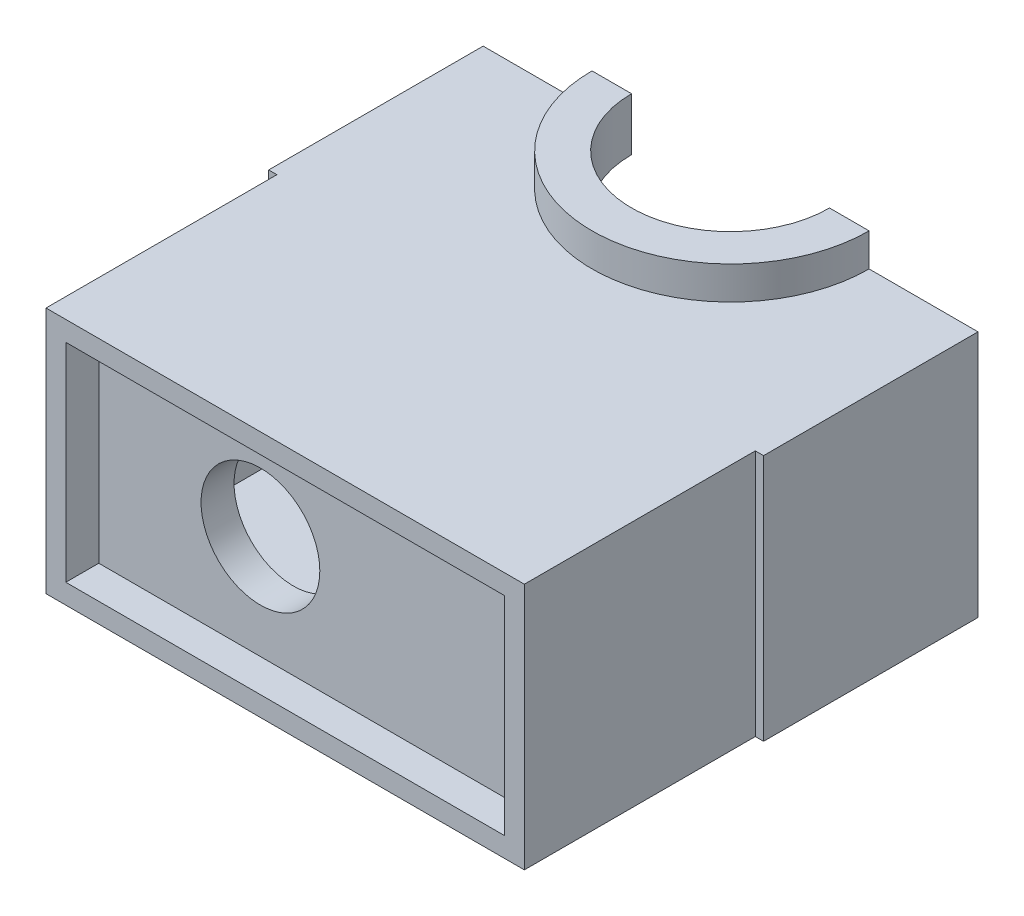
ISO-10303-21;
HEADER;
FILE_DESCRIPTION(('STEP AP214'),'2;1');
FILE_NAME('part.step','',(''),(''),'','','');
FILE_SCHEMA(('AUTOMOTIVE_DESIGN { 1 0 10303 214 1 1 1 1 }'));
ENDSEC;
DATA;
#1=APPLICATION_CONTEXT('core data for automotive mechanical design processes');
#2=APPLICATION_PROTOCOL_DEFINITION('international standard','automotive_design',2000,#1);
#3=PRODUCT_CONTEXT('',#1,'mechanical');
#4=PRODUCT('Part','Part','',(#3));
#5=PRODUCT_RELATED_PRODUCT_CATEGORY('part','',(#4));
#6=PRODUCT_DEFINITION_FORMATION('','',#4);
#7=PRODUCT_DEFINITION_CONTEXT('part definition',#1,'design');
#8=PRODUCT_DEFINITION('design','',#6,#7);
#9=PRODUCT_DEFINITION_SHAPE('','',#8);
#10=(LENGTH_UNIT() NAMED_UNIT(*) SI_UNIT(.MILLI.,.METRE.));
#11=(NAMED_UNIT(*) PLANE_ANGLE_UNIT() SI_UNIT($,.RADIAN.));
#12=(NAMED_UNIT(*) SI_UNIT($,.STERADIAN.) SOLID_ANGLE_UNIT());
#13=UNCERTAINTY_MEASURE_WITH_UNIT(LENGTH_MEASURE(1.E-05),#10,'distance_accuracy_value','');
#14=(GEOMETRIC_REPRESENTATION_CONTEXT(3) GLOBAL_UNCERTAINTY_ASSIGNED_CONTEXT((#13)) GLOBAL_UNIT_ASSIGNED_CONTEXT((#10,
#11,#12)) REPRESENTATION_CONTEXT('',''));
#15=CARTESIAN_POINT('',(0.,0.,0.));
#16=DIRECTION('',(0.,0.,1.));
#17=DIRECTION('',(1.,0.,0.));
#18=AXIS2_PLACEMENT_3D('',#15,#16,#17);
#19=CARTESIAN_POINT('',(0.,0.,-11.5));
#20=DIRECTION('',(0.,0.,-1.));
#21=DIRECTION('',(-1.,0.,0.));
#22=AXIS2_PLACEMENT_3D('',#19,#20,#21);
#23=PLANE('',#22);
#24=DIRECTION('',(-1.,0.,0.));
#25=VECTOR('',#24,1.);
#26=CARTESIAN_POINT('',(0.,3.15,-11.5));
#27=LINE('',#26,#25);
#28=CARTESIAN_POINT('',(8.65,3.15,-11.5));
#29=VERTEX_POINT('',#28);
#30=CARTESIAN_POINT('',(4.75,3.15,-11.5));
#31=VERTEX_POINT('',#30);
#32=EDGE_CURVE('E254',#29,#31,#27,.T.);
#33=ORIENTED_EDGE('',*,*,#32,.T.);
#34=DIRECTION('',(0.,-1.,0.));
#35=VECTOR('',#34,1.);
#36=CARTESIAN_POINT('',(4.75,4.75,-11.5));
#37=LINE('',#36,#35);
#38=CARTESIAN_POINT('',(4.75,4.75,-11.5));
#39=VERTEX_POINT('',#38);
#40=EDGE_CURVE('E448',#39,#31,#37,.T.);
#41=ORIENTED_EDGE('',*,*,#40,.F.);
#42=DIRECTION('',(-1.,0.,0.));
#43=VECTOR('',#42,1.);
#44=CARTESIAN_POINT('',(0.,4.75,-11.5));
#45=LINE('',#44,#43);
#46=CARTESIAN_POINT('',(5.95,4.75,-11.5));
#47=VERTEX_POINT('',#46);
#48=EDGE_CURVE('E458',#47,#39,#45,.T.);
#49=ORIENTED_EDGE('',*,*,#48,.F.);
#50=DIRECTION('',(0.,-1.,0.));
#51=VECTOR('',#50,1.);
#52=CARTESIAN_POINT('',(5.95,4.75,-11.5));
#53=LINE('',#52,#51);
#54=CARTESIAN_POINT('',(5.95,3.75,-11.5));
#55=VERTEX_POINT('',#54);
#56=EDGE_CURVE('E445',#47,#55,#53,.T.);
#57=ORIENTED_EDGE('',*,*,#56,.T.);
#58=DIRECTION('',(1.,0.,0.));
#59=VECTOR('',#58,1.);
#60=CARTESIAN_POINT('',(0.,3.75,-11.5));
#61=LINE('',#60,#59);
#62=CARTESIAN_POINT('',(9.25,3.75,-11.5));
#63=VERTEX_POINT('',#62);
#64=EDGE_CURVE('E282',#55,#63,#61,.T.);
#65=ORIENTED_EDGE('',*,*,#64,.T.);
#66=DIRECTION('',(0.,1.,0.));
#67=VECTOR('',#66,1.);
#68=CARTESIAN_POINT('',(9.25,0.,-11.5));
#69=LINE('',#68,#67);
#70=CARTESIAN_POINT('',(9.25,-3.75,-11.5));
#71=VERTEX_POINT('',#70);
#72=EDGE_CURVE('E436',#71,#63,#69,.T.);
#73=ORIENTED_EDGE('',*,*,#72,.F.);
#74=DIRECTION('',(-1.,0.,0.));
#75=VECTOR('',#74,1.);
#76=CARTESIAN_POINT('',(0.,-3.75,-11.5));
#77=LINE('',#76,#75);
#78=CARTESIAN_POINT('',(5.95,-3.75,-11.5));
#79=VERTEX_POINT('',#78);
#80=EDGE_CURVE('E433',#71,#79,#77,.T.);
#81=ORIENTED_EDGE('',*,*,#80,.T.);
#82=DIRECTION('',(0.,1.,0.));
#83=VECTOR('',#82,1.);
#84=CARTESIAN_POINT('',(5.95,-4.75,-11.5));
#85=LINE('',#84,#83);
#86=CARTESIAN_POINT('',(5.95,-4.75,-11.5));
#87=VERTEX_POINT('',#86);
#88=EDGE_CURVE('E464',#87,#79,#85,.T.);
#89=ORIENTED_EDGE('',*,*,#88,.F.);
#90=DIRECTION('',(1.,0.,0.));
#91=VECTOR('',#90,1.);
#92=CARTESIAN_POINT('',(0.,-4.75,-11.5));
#93=LINE('',#92,#91);
#94=CARTESIAN_POINT('',(4.75,-4.75,-11.5));
#95=VERTEX_POINT('',#94);
#96=EDGE_CURVE('E472',#95,#87,#93,.T.);
#97=ORIENTED_EDGE('',*,*,#96,.F.);
#98=DIRECTION('',(0.,1.,0.));
#99=VECTOR('',#98,1.);
#100=CARTESIAN_POINT('',(4.75,-4.75,-11.5));
#101=LINE('',#100,#99);
#102=CARTESIAN_POINT('',(4.75,-3.15,-11.5));
#103=VERTEX_POINT('',#102);
#104=EDGE_CURVE('E426',#95,#103,#101,.T.);
#105=ORIENTED_EDGE('',*,*,#104,.T.);
#106=DIRECTION('',(-1.,0.,0.));
#107=VECTOR('',#106,1.);
#108=CARTESIAN_POINT('',(0.,-3.15,-11.5));
#109=LINE('',#108,#107);
#110=CARTESIAN_POINT('',(8.65,-3.15,-11.5));
#111=VERTEX_POINT('',#110);
#112=EDGE_CURVE('E245',#111,#103,#109,.T.);
#113=ORIENTED_EDGE('',*,*,#112,.F.);
#114=DIRECTION('',(0.,-1.,0.));
#115=VECTOR('',#114,1.);
#116=CARTESIAN_POINT('',(8.65,0.,-11.5));
#117=LINE('',#116,#115);
#118=EDGE_CURVE('E253',#29,#111,#117,.T.);
#119=ORIENTED_EDGE('',*,*,#118,.F.);
#120=EDGE_LOOP('',(#33,#41,#49,#57,#65,#73,#81,#89,#97,#105,#113,#119));
#121=FACE_BOUND('',#120,.T.);
#122=ADVANCED_FACE('F37',(#121),#23,.T.);
#123=CARTESIAN_POINT('',(0.,0.,-5.));
#124=DIRECTION('',(0.,0.,1.));
#125=DIRECTION('',(1.,0.,0.));
#126=AXIS2_PLACEMENT_3D('',#123,#124,#125);
#127=PLANE('',#126);
#128=DIRECTION('',(-1.,0.,0.));
#129=VECTOR('',#128,1.);
#130=CARTESIAN_POINT('',(0.,3.15,-5.));
#131=LINE('',#130,#129);
#132=CARTESIAN_POINT('',(8.65,3.15,-5.));
#133=VERTEX_POINT('',#132);
#134=CARTESIAN_POINT('',(8.4,3.15,-5.));
#135=VERTEX_POINT('',#134);
#136=EDGE_CURVE('E48',#133,#135,#131,.T.);
#137=ORIENTED_EDGE('',*,*,#136,.F.);
#138=DIRECTION('',(0.,-1.,0.));
#139=VECTOR('',#138,1.);
#140=CARTESIAN_POINT('',(8.65,0.,-5.));
#141=LINE('',#140,#139);
#142=CARTESIAN_POINT('',(8.65,-3.15,-5.));
#143=VERTEX_POINT('',#142);
#144=EDGE_CURVE('E280',#133,#143,#141,.T.);
#145=ORIENTED_EDGE('',*,*,#144,.T.);
#146=DIRECTION('',(-1.,0.,0.));
#147=VECTOR('',#146,1.);
#148=CARTESIAN_POINT('',(0.,-3.15,-5.));
#149=LINE('',#148,#147);
#150=CARTESIAN_POINT('',(8.4,-3.15,-5.));
#151=VERTEX_POINT('',#150);
#152=EDGE_CURVE('E278',#143,#151,#149,.T.);
#153=ORIENTED_EDGE('',*,*,#152,.T.);
#154=DIRECTION('',(0.,1.,0.));
#155=VECTOR('',#154,1.);
#156=CARTESIAN_POINT('',(8.4,0.,-5.));
#157=LINE('',#156,#155);
#158=EDGE_CURVE('E305',#151,#135,#157,.T.);
#159=ORIENTED_EDGE('',*,*,#158,.T.);
#160=EDGE_LOOP('',(#137,#145,#153,#159));
#161=FACE_BOUND('',#160,.T.);
#162=ADVANCED_FACE('F419',(#161),#127,.F.);
#163=CARTESIAN_POINT('',(-4.9,3.15,-5.));
#164=VERTEX_POINT('',#163);
#165=CARTESIAN_POINT('',(-5.15,3.15,-5.));
#166=VERTEX_POINT('',#165);
#167=EDGE_CURVE('E11',#164,#166,#131,.T.);
#168=ORIENTED_EDGE('',*,*,#167,.F.);
#169=DIRECTION('',(0.,1.,0.));
#170=VECTOR('',#169,1.);
#171=CARTESIAN_POINT('',(-4.9,0.,-5.));
#172=LINE('',#171,#170);
#173=CARTESIAN_POINT('',(-4.9,-3.15,-5.));
#174=VERTEX_POINT('',#173);
#175=EDGE_CURVE('E307',#174,#164,#172,.T.);
#176=ORIENTED_EDGE('',*,*,#175,.F.);
#177=CARTESIAN_POINT('',(-5.15,-3.15,-5.));
#178=VERTEX_POINT('',#177);
#179=EDGE_CURVE('E46',#174,#178,#149,.T.);
#180=ORIENTED_EDGE('',*,*,#179,.T.);
#181=DIRECTION('',(0.,-1.,0.));
#182=VECTOR('',#181,1.);
#183=CARTESIAN_POINT('',(-5.15,0.,-5.));
#184=LINE('',#183,#182);
#185=EDGE_CURVE('E275',#166,#178,#184,.T.);
#186=ORIENTED_EDGE('',*,*,#185,.F.);
#187=EDGE_LOOP('',(#168,#176,#180,#186));
#188=FACE_BOUND('',#187,.T.);
#189=ADVANCED_FACE('F397',(#188),#127,.F.);
#190=CARTESIAN_POINT('',(0.,0.,0.));
#191=DIRECTION('',(0.,0.,1.));
#192=DIRECTION('',(1.,0.,0.));
#193=AXIS2_PLACEMENT_3D('',#190,#191,#192);
#194=PLANE('',#193);
#195=CARTESIAN_POINT('',(0.,0.,0.));
#196=DIRECTION('',(0.,0.,1.));
#197=DIRECTION('',(1.,0.,0.));
#198=AXIS2_PLACEMENT_3D('',#195,#196,#197);
#199=CIRCLE('',#198,1.8);
#200=CARTESIAN_POINT('',(1.8,0.,0.));
#201=VERTEX_POINT('',#200);
#202=EDGE_CURVE('E41',#201,#201,#199,.T.);
#203=ORIENTED_EDGE('',*,*,#202,.T.);
#204=EDGE_LOOP('',(#203));
#205=FACE_BOUND('',#204,.T.);
#206=DIRECTION('',(0.,1.,0.));
#207=VECTOR('',#206,1.);
#208=CARTESIAN_POINT('',(8.4,0.,0.));
#209=LINE('',#208,#207);
#210=CARTESIAN_POINT('',(8.4,-3.15,0.));
#211=VERTEX_POINT('',#210);
#212=CARTESIAN_POINT('',(8.4,3.15,0.));
#213=VERTEX_POINT('',#212);
#214=EDGE_CURVE('E295',#211,#213,#209,.T.);
#215=ORIENTED_EDGE('',*,*,#214,.F.);
#216=DIRECTION('',(1.,0.,0.));
#217=VECTOR('',#216,1.);
#218=CARTESIAN_POINT('',(0.,-3.15,0.));
#219=LINE('',#218,#217);
#220=CARTESIAN_POINT('',(-4.9,-3.15,0.));
#221=VERTEX_POINT('',#220);
#222=EDGE_CURVE('E319',#221,#211,#219,.T.);
#223=ORIENTED_EDGE('',*,*,#222,.F.);
#224=DIRECTION('',(0.,1.,0.));
#225=VECTOR('',#224,1.);
#226=CARTESIAN_POINT('',(-4.9,0.,0.));
#227=LINE('',#226,#225);
#228=CARTESIAN_POINT('',(-4.9,3.15,0.));
#229=VERTEX_POINT('',#228);
#230=EDGE_CURVE('E322',#221,#229,#227,.T.);
#231=ORIENTED_EDGE('',*,*,#230,.T.);
#232=DIRECTION('',(1.,0.,0.));
#233=VECTOR('',#232,1.);
#234=CARTESIAN_POINT('',(0.,3.15,0.));
#235=LINE('',#234,#233);
#236=EDGE_CURVE('E308',#229,#213,#235,.T.);
#237=ORIENTED_EDGE('',*,*,#236,.T.);
#238=EDGE_LOOP('',(#215,#223,#231,#237));
#239=FACE_BOUND('',#238,.T.);
#240=ADVANCED_FACE('F592',(#205,#239),#194,.F.);
#241=CARTESIAN_POINT('',(0.,0.,1.));
#242=DIRECTION('',(0.,0.,-1.));
#243=DIRECTION('',(-1.,0.,0.));
#244=AXIS2_PLACEMENT_3D('',#241,#242,#243);
#245=CYLINDRICAL_SURFACE('',#244,1.8);
#246=CARTESIAN_POINT('',(0.,0.,1.));
#247=DIRECTION('',(0.,0.,1.));
#248=DIRECTION('',(1.,0.,0.));
#249=AXIS2_PLACEMENT_3D('',#246,#247,#248);
#250=CIRCLE('',#249,1.8);
#251=CARTESIAN_POINT('',(1.8,0.,1.));
#252=VERTEX_POINT('',#251);
#253=EDGE_CURVE('E381',#252,#252,#250,.T.);
#254=ORIENTED_EDGE('',*,*,#253,.T.);
#255=EDGE_LOOP('',(#254));
#256=FACE_BOUND('',#255,.T.);
#257=ORIENTED_EDGE('',*,*,#202,.F.);
#258=EDGE_LOOP('',(#257));
#259=FACE_BOUND('',#258,.T.);
#260=ADVANCED_FACE('F39',(#256,#259),#245,.F.);
#261=CARTESIAN_POINT('',(0.,0.,1.));
#262=DIRECTION('',(0.,0.,1.));
#263=DIRECTION('',(1.,0.,0.));
#264=AXIS2_PLACEMENT_3D('',#261,#262,#263);
#265=PLANE('',#264);
#266=ORIENTED_EDGE('',*,*,#253,.F.);
#267=EDGE_LOOP('',(#266));
#268=FACE_BOUND('',#267,.T.);
#269=DIRECTION('',(1.,0.,0.));
#270=VECTOR('',#269,1.);
#271=CARTESIAN_POINT('',(0.,-3.15,1.));
#272=LINE('',#271,#270);
#273=CARTESIAN_POINT('',(-4.9,-3.15,1.));
#274=VERTEX_POINT('',#273);
#275=CARTESIAN_POINT('',(8.4,-3.15,1.));
#276=VERTEX_POINT('',#275);
#277=EDGE_CURVE('E384',#274,#276,#272,.T.);
#278=ORIENTED_EDGE('',*,*,#277,.T.);
#279=DIRECTION('',(0.,1.,0.));
#280=VECTOR('',#279,1.);
#281=CARTESIAN_POINT('',(8.4,0.,1.));
#282=LINE('',#281,#280);
#283=CARTESIAN_POINT('',(8.4,3.15,1.));
#284=VERTEX_POINT('',#283);
#285=EDGE_CURVE('E386',#276,#284,#282,.T.);
#286=ORIENTED_EDGE('',*,*,#285,.T.);
#287=DIRECTION('',(1.,0.,0.));
#288=VECTOR('',#287,1.);
#289=CARTESIAN_POINT('',(0.,3.15,1.));
#290=LINE('',#289,#288);
#291=CARTESIAN_POINT('',(-4.9,3.15,1.));
#292=VERTEX_POINT('',#291);
#293=EDGE_CURVE('E388',#292,#284,#290,.T.);
#294=ORIENTED_EDGE('',*,*,#293,.F.);
#295=DIRECTION('',(0.,1.,0.));
#296=VECTOR('',#295,1.);
#297=CARTESIAN_POINT('',(-4.9,0.,1.));
#298=LINE('',#297,#296);
#299=EDGE_CURVE('E390',#274,#292,#298,.T.);
#300=ORIENTED_EDGE('',*,*,#299,.F.);
#301=EDGE_LOOP('',(#278,#286,#294,#300));
#302=FACE_BOUND('',#301,.T.);
#303=ADVANCED_FACE('F576',(#268,#302),#265,.T.);
#304=CARTESIAN_POINT('',(0.,-3.75,2.));
#305=DIRECTION('',(0.,1.,0.));
#306=DIRECTION('',(0.,0.,1.));
#307=AXIS2_PLACEMENT_3D('',#304,#305,#306);
#308=PLANE('',#307);
#309=CARTESIAN_POINT('',(1.75,-3.75,-11.5));
#310=DIRECTION('',(0.,-1.,0.));
#311=DIRECTION('',(0.,0.,-1.));
#312=AXIS2_PLACEMENT_3D('',#309,#310,#311);
#313=CIRCLE('',#312,4.2);
#314=CARTESIAN_POINT('',(-2.45,-3.75,-11.5));
#315=VERTEX_POINT('',#314);
#316=EDGE_CURVE('E63',#79,#315,#313,.T.);
#317=ORIENTED_EDGE('',*,*,#316,.F.);
#318=ORIENTED_EDGE('',*,*,#80,.F.);
#319=DIRECTION('',(0.,0.,1.));
#320=VECTOR('',#319,1.);
#321=CARTESIAN_POINT('',(9.25,-3.75,-11.5));
#322=LINE('',#321,#320);
#323=CARTESIAN_POINT('',(9.25,-3.75,-5.));
#324=VERTEX_POINT('',#323);
#325=EDGE_CURVE('E301',#71,#324,#322,.T.);
#326=ORIENTED_EDGE('',*,*,#325,.T.);
#327=DIRECTION('',(-1.,0.,0.));
#328=VECTOR('',#327,1.);
#329=CARTESIAN_POINT('',(0.,-3.75,-5.));
#330=LINE('',#329,#328);
#331=CARTESIAN_POINT('',(9.,-3.75,-5.));
#332=VERTEX_POINT('',#331);
#333=EDGE_CURVE('E269',#324,#332,#330,.T.);
#334=ORIENTED_EDGE('',*,*,#333,.T.);
#335=DIRECTION('',(0.,0.,-1.));
#336=VECTOR('',#335,1.);
#337=CARTESIAN_POINT('',(9.,-3.75,2.));
#338=LINE('',#337,#336);
#339=CARTESIAN_POINT('',(9.,-3.75,2.));
#340=VERTEX_POINT('',#339);
#341=EDGE_CURVE('E368',#340,#332,#338,.T.);
#342=ORIENTED_EDGE('',*,*,#341,.F.);
#343=DIRECTION('',(1.,0.,0.));
#344=VECTOR('',#343,1.);
#345=CARTESIAN_POINT('',(0.,-3.75,2.));
#346=LINE('',#345,#344);
#347=CARTESIAN_POINT('',(-5.5,-3.75,2.));
#348=VERTEX_POINT('',#347);
#349=EDGE_CURVE('E346',#348,#340,#346,.T.);
#350=ORIENTED_EDGE('',*,*,#349,.F.);
#351=DIRECTION('',(0.,0.,-1.));
#352=VECTOR('',#351,1.);
#353=CARTESIAN_POINT('',(-5.5,-3.75,2.));
#354=LINE('',#353,#352);
#355=CARTESIAN_POINT('',(-5.5,-3.75,-5.));
#356=VERTEX_POINT('',#355);
#357=EDGE_CURVE('E358',#348,#356,#354,.T.);
#358=ORIENTED_EDGE('',*,*,#357,.T.);
#359=CARTESIAN_POINT('',(-5.75,-3.75,-5.));
#360=VERTEX_POINT('',#359);
#361=EDGE_CURVE('E268',#356,#360,#330,.T.);
#362=ORIENTED_EDGE('',*,*,#361,.T.);
#363=DIRECTION('',(0.,0.,1.));
#364=VECTOR('',#363,1.);
#365=CARTESIAN_POINT('',(-5.75,-3.75,-11.5));
#366=LINE('',#365,#364);
#367=CARTESIAN_POINT('',(-5.75,-3.75,-11.5));
#368=VERTEX_POINT('',#367);
#369=EDGE_CURVE('E298',#368,#360,#366,.T.);
#370=ORIENTED_EDGE('',*,*,#369,.F.);
#371=EDGE_CURVE('E435',#315,#368,#77,.T.);
#372=ORIENTED_EDGE('',*,*,#371,.F.);
#373=EDGE_LOOP('',(#317,#318,#326,#334,#342,#350,#358,#362,#370,#372));
#374=FACE_BOUND('',#373,.T.);
#375=ADVANCED_FACE('F517',(#374),#308,.F.);
#376=CARTESIAN_POINT('',(9.,0.,2.));
#377=DIRECTION('',(-1.,0.,0.));
#378=DIRECTION('',(0.,0.,1.));
#379=AXIS2_PLACEMENT_3D('',#376,#377,#378);
#380=PLANE('',#379);
#381=ORIENTED_EDGE('',*,*,#341,.T.);
#382=DIRECTION('',(0.,1.,0.));
#383=VECTOR('',#382,1.);
#384=CARTESIAN_POINT('',(9.,0.,-5.));
#385=LINE('',#384,#383);
#386=CARTESIAN_POINT('',(9.,3.75,-5.));
#387=VERTEX_POINT('',#386);
#388=EDGE_CURVE('E311',#332,#387,#385,.T.);
#389=ORIENTED_EDGE('',*,*,#388,.T.);
#390=DIRECTION('',(0.,0.,-1.));
#391=VECTOR('',#390,1.);
#392=CARTESIAN_POINT('',(9.,3.75,2.));
#393=LINE('',#392,#391);
#394=CARTESIAN_POINT('',(9.,3.75,2.));
#395=VERTEX_POINT('',#394);
#396=EDGE_CURVE('E365',#395,#387,#393,.T.);
#397=ORIENTED_EDGE('',*,*,#396,.F.);
#398=DIRECTION('',(0.,1.,0.));
#399=VECTOR('',#398,1.);
#400=CARTESIAN_POINT('',(9.,0.,2.));
#401=LINE('',#400,#399);
#402=EDGE_CURVE('E349',#340,#395,#401,.T.);
#403=ORIENTED_EDGE('',*,*,#402,.F.);
#404=EDGE_LOOP('',(#381,#389,#397,#403));
#405=FACE_BOUND('',#404,.T.);
#406=ADVANCED_FACE('F509',(#405),#380,.F.);
#407=CARTESIAN_POINT('',(0.,3.75,2.));
#408=DIRECTION('',(0.,1.,0.));
#409=DIRECTION('',(0.,0.,1.));
#410=AXIS2_PLACEMENT_3D('',#407,#408,#409);
#411=PLANE('',#410);
#412=CARTESIAN_POINT('',(1.75,3.75,-11.5));
#413=DIRECTION('',(0.,1.,0.));
#414=DIRECTION('',(0.,0.,1.));
#415=AXIS2_PLACEMENT_3D('',#412,#413,#414);
#416=CIRCLE('',#415,4.2);
#417=CARTESIAN_POINT('',(-2.45,3.75,-11.5));
#418=VERTEX_POINT('',#417);
#419=EDGE_CURVE('E452',#418,#55,#416,.T.);
#420=ORIENTED_EDGE('',*,*,#419,.F.);
#421=CARTESIAN_POINT('',(-5.75,3.75,-11.5));
#422=VERTEX_POINT('',#421);
#423=EDGE_CURVE('E439',#422,#418,#61,.T.);
#424=ORIENTED_EDGE('',*,*,#423,.F.);
#425=DIRECTION('',(0.,0.,1.));
#426=VECTOR('',#425,1.);
#427=CARTESIAN_POINT('',(-5.75,3.75,-11.5));
#428=LINE('',#427,#426);
#429=CARTESIAN_POINT('',(-5.75,3.75,-5.));
#430=VERTEX_POINT('',#429);
#431=EDGE_CURVE('E260',#422,#430,#428,.T.);
#432=ORIENTED_EDGE('',*,*,#431,.T.);
#433=DIRECTION('',(1.,0.,0.));
#434=VECTOR('',#433,1.);
#435=CARTESIAN_POINT('',(0.,3.75,-5.));
#436=LINE('',#435,#434);
#437=CARTESIAN_POINT('',(-5.5,3.75,-5.));
#438=VERTEX_POINT('',#437);
#439=EDGE_CURVE('E261',#430,#438,#436,.T.);
#440=ORIENTED_EDGE('',*,*,#439,.T.);
#441=DIRECTION('',(0.,0.,-1.));
#442=VECTOR('',#441,1.);
#443=CARTESIAN_POINT('',(-5.5,3.75,2.));
#444=LINE('',#443,#442);
#445=CARTESIAN_POINT('',(-5.5,3.75,2.));
#446=VERTEX_POINT('',#445);
#447=EDGE_CURVE('E361',#446,#438,#444,.T.);
#448=ORIENTED_EDGE('',*,*,#447,.F.);
#449=DIRECTION('',(1.,0.,0.));
#450=VECTOR('',#449,1.);
#451=CARTESIAN_POINT('',(0.,3.75,2.));
#452=LINE('',#451,#450);
#453=EDGE_CURVE('E351',#446,#395,#452,.T.);
#454=ORIENTED_EDGE('',*,*,#453,.T.);
#455=ORIENTED_EDGE('',*,*,#396,.T.);
#456=CARTESIAN_POINT('',(9.25,3.75,-5.));
#457=VERTEX_POINT('',#456);
#458=EDGE_CURVE('E265',#387,#457,#436,.T.);
#459=ORIENTED_EDGE('',*,*,#458,.T.);
#460=DIRECTION('',(0.,0.,1.));
#461=VECTOR('',#460,1.);
#462=CARTESIAN_POINT('',(9.25,3.75,-11.5));
#463=LINE('',#462,#461);
#464=EDGE_CURVE('E287',#63,#457,#463,.T.);
#465=ORIENTED_EDGE('',*,*,#464,.F.);
#466=ORIENTED_EDGE('',*,*,#64,.F.);
#467=EDGE_LOOP('',(#420,#424,#432,#440,#448,#454,#455,#459,#465,#466));
#468=FACE_BOUND('',#467,.T.);
#469=ADVANCED_FACE('F487',(#468),#411,.T.);
#470=CARTESIAN_POINT('',(8.4,0.,2.));
#471=DIRECTION('',(-1.,0.,0.));
#472=DIRECTION('',(0.,0.,1.));
#473=AXIS2_PLACEMENT_3D('',#470,#471,#472);
#474=PLANE('',#473);
#475=DIRECTION('',(0.,0.,-1.));
#476=VECTOR('',#475,1.);
#477=CARTESIAN_POINT('',(8.4,3.15,2.));
#478=LINE('',#477,#476);
#479=CARTESIAN_POINT('',(8.4,3.15,2.));
#480=VERTEX_POINT('',#479);
#481=EDGE_CURVE('E357',#480,#284,#478,.T.);
#482=ORIENTED_EDGE('',*,*,#481,.T.);
#483=ORIENTED_EDGE('',*,*,#285,.F.);
#484=DIRECTION('',(0.,0.,-1.));
#485=VECTOR('',#484,1.);
#486=CARTESIAN_POINT('',(8.4,-3.15,2.));
#487=LINE('',#486,#485);
#488=CARTESIAN_POINT('',(8.4,-3.15,2.));
#489=VERTEX_POINT('',#488);
#490=EDGE_CURVE('E362',#489,#276,#487,.T.);
#491=ORIENTED_EDGE('',*,*,#490,.F.);
#492=DIRECTION('',(0.,1.,0.));
#493=VECTOR('',#492,1.);
#494=CARTESIAN_POINT('',(8.4,0.,2.));
#495=LINE('',#494,#493);
#496=EDGE_CURVE('E328',#489,#480,#495,.T.);
#497=ORIENTED_EDGE('',*,*,#496,.T.);
#498=EDGE_LOOP('',(#482,#483,#491,#497));
#499=FACE_BOUND('',#498,.T.);
#500=ADVANCED_FACE('F571',(#499),#474,.T.);
#501=CARTESIAN_POINT('',(0.,-3.15,2.));
#502=DIRECTION('',(0.,1.,0.));
#503=DIRECTION('',(0.,0.,1.));
#504=AXIS2_PLACEMENT_3D('',#501,#502,#503);
#505=PLANE('',#504);
#506=ORIENTED_EDGE('',*,*,#490,.T.);
#507=ORIENTED_EDGE('',*,*,#277,.F.);
#508=DIRECTION('',(0.,0.,-1.));
#509=VECTOR('',#508,1.);
#510=CARTESIAN_POINT('',(-4.9,-3.15,2.));
#511=LINE('',#510,#509);
#512=CARTESIAN_POINT('',(-4.9,-3.15,2.));
#513=VERTEX_POINT('',#512);
#514=EDGE_CURVE('E376',#513,#274,#511,.T.);
#515=ORIENTED_EDGE('',*,*,#514,.F.);
#516=DIRECTION('',(1.,0.,0.));
#517=VECTOR('',#516,1.);
#518=CARTESIAN_POINT('',(0.,-3.15,2.));
#519=LINE('',#518,#517);
#520=EDGE_CURVE('E339',#513,#489,#519,.T.);
#521=ORIENTED_EDGE('',*,*,#520,.T.);
#522=EDGE_LOOP('',(#506,#507,#515,#521));
#523=FACE_BOUND('',#522,.T.);
#524=ADVANCED_FACE('F583',(#523),#505,.T.);
#525=CARTESIAN_POINT('',(-4.9,0.,2.));
#526=DIRECTION('',(-1.,0.,0.));
#527=DIRECTION('',(0.,0.,1.));
#528=AXIS2_PLACEMENT_3D('',#525,#526,#527);
#529=PLANE('',#528);
#530=ORIENTED_EDGE('',*,*,#299,.T.);
#531=DIRECTION('',(0.,0.,-1.));
#532=VECTOR('',#531,1.);
#533=CARTESIAN_POINT('',(-4.9,3.15,2.));
#534=LINE('',#533,#532);
#535=CARTESIAN_POINT('',(-4.9,3.15,2.));
#536=VERTEX_POINT('',#535);
#537=EDGE_CURVE('E373',#536,#292,#534,.T.);
#538=ORIENTED_EDGE('',*,*,#537,.F.);
#539=DIRECTION('',(0.,1.,0.));
#540=VECTOR('',#539,1.);
#541=CARTESIAN_POINT('',(-4.9,0.,2.));
#542=LINE('',#541,#540);
#543=EDGE_CURVE('E342',#513,#536,#542,.T.);
#544=ORIENTED_EDGE('',*,*,#543,.F.);
#545=ORIENTED_EDGE('',*,*,#514,.T.);
#546=EDGE_LOOP('',(#530,#538,#544,#545));
#547=FACE_BOUND('',#546,.T.);
#548=ADVANCED_FACE('F579',(#547),#529,.F.);
#549=CARTESIAN_POINT('',(0.,3.15,2.));
#550=DIRECTION('',(0.,1.,0.));
#551=DIRECTION('',(0.,0.,1.));
#552=AXIS2_PLACEMENT_3D('',#549,#550,#551);
#553=PLANE('',#552);
#554=ORIENTED_EDGE('',*,*,#293,.T.);
#555=ORIENTED_EDGE('',*,*,#481,.F.);
#556=DIRECTION('',(1.,0.,0.));
#557=VECTOR('',#556,1.);
#558=CARTESIAN_POINT('',(0.,3.15,2.));
#559=LINE('',#558,#557);
#560=EDGE_CURVE('E344',#536,#480,#559,.T.);
#561=ORIENTED_EDGE('',*,*,#560,.F.);
#562=ORIENTED_EDGE('',*,*,#537,.T.);
#563=EDGE_LOOP('',(#554,#555,#561,#562));
#564=FACE_BOUND('',#563,.T.);
#565=ADVANCED_FACE('F568',(#564),#553,.F.);
#566=CARTESIAN_POINT('',(-5.5,0.,2.));
#567=DIRECTION('',(-1.,0.,0.));
#568=DIRECTION('',(0.,0.,1.));
#569=AXIS2_PLACEMENT_3D('',#566,#567,#568);
#570=PLANE('',#569);
#571=ORIENTED_EDGE('',*,*,#447,.T.);
#572=DIRECTION('',(0.,1.,0.));
#573=VECTOR('',#572,1.);
#574=CARTESIAN_POINT('',(-5.5,0.,-5.));
#575=LINE('',#574,#573);
#576=EDGE_CURVE('E314',#356,#438,#575,.T.);
#577=ORIENTED_EDGE('',*,*,#576,.F.);
#578=ORIENTED_EDGE('',*,*,#357,.F.);
#579=DIRECTION('',(0.,1.,0.));
#580=VECTOR('',#579,1.);
#581=CARTESIAN_POINT('',(-5.5,0.,2.));
#582=LINE('',#581,#580);
#583=EDGE_CURVE('E354',#348,#446,#582,.T.);
#584=ORIENTED_EDGE('',*,*,#583,.T.);
#585=EDGE_LOOP('',(#571,#577,#578,#584));
#586=FACE_BOUND('',#585,.T.);
#587=ADVANCED_FACE('F500',(#586),#570,.T.);
#588=CARTESIAN_POINT('',(0.,0.,2.));
#589=DIRECTION('',(0.,0.,1.));
#590=DIRECTION('',(1.,0.,0.));
#591=AXIS2_PLACEMENT_3D('',#588,#589,#590);
#592=PLANE('',#591);
#593=ORIENTED_EDGE('',*,*,#496,.F.);
#594=ORIENTED_EDGE('',*,*,#520,.F.);
#595=ORIENTED_EDGE('',*,*,#543,.T.);
#596=ORIENTED_EDGE('',*,*,#560,.T.);
#597=EDGE_LOOP('',(#593,#594,#595,#596));
#598=FACE_BOUND('',#597,.T.);
#599=ORIENTED_EDGE('',*,*,#349,.T.);
#600=ORIENTED_EDGE('',*,*,#402,.T.);
#601=ORIENTED_EDGE('',*,*,#453,.F.);
#602=ORIENTED_EDGE('',*,*,#583,.F.);
#603=EDGE_LOOP('',(#599,#600,#601,#602));
#604=FACE_BOUND('',#603,.T.);
#605=ADVANCED_FACE('F505',(#598,#604),#592,.T.);
#606=CARTESIAN_POINT('',(8.4,0.,-5.));
#607=DIRECTION('',(1.,0.,0.));
#608=DIRECTION('',(0.,0.,-1.));
#609=AXIS2_PLACEMENT_3D('',#606,#607,#608);
#610=PLANE('',#609);
#611=ORIENTED_EDGE('',*,*,#214,.T.);
#612=DIRECTION('',(0.,0.,1.));
#613=VECTOR('',#612,1.);
#614=CARTESIAN_POINT('',(8.4,3.15,-5.));
#615=LINE('',#614,#613);
#616=EDGE_CURVE('E325',#135,#213,#615,.T.);
#617=ORIENTED_EDGE('',*,*,#616,.F.);
#618=ORIENTED_EDGE('',*,*,#158,.F.);
#619=DIRECTION('',(0.,0.,1.));
#620=VECTOR('',#619,1.);
#621=CARTESIAN_POINT('',(8.4,-3.15,-5.));
#622=LINE('',#621,#620);
#623=EDGE_CURVE('E316',#151,#211,#622,.T.);
#624=ORIENTED_EDGE('',*,*,#623,.T.);
#625=EDGE_LOOP('',(#611,#617,#618,#624));
#626=FACE_BOUND('',#625,.T.);
#627=ADVANCED_FACE('F416',(#626),#610,.F.);
#628=CARTESIAN_POINT('',(0.,3.15,-5.));
#629=DIRECTION('',(0.,-1.,0.));
#630=DIRECTION('',(0.,0.,-1.));
#631=AXIS2_PLACEMENT_3D('',#628,#629,#630);
#632=PLANE('',#631);
#633=CARTESIAN_POINT('',(1.75,3.15,-11.5));
#634=DIRECTION('',(0.,-1.,0.));
#635=DIRECTION('',(0.,0.,-1.));
#636=AXIS2_PLACEMENT_3D('',#633,#634,#635);
#637=CIRCLE('',#636,3.);
#638=CARTESIAN_POINT('',(-1.25,3.15,-11.5));
#639=VERTEX_POINT('',#638);
#640=EDGE_CURVE('E246',#31,#639,#637,.T.);
#641=ORIENTED_EDGE('',*,*,#640,.F.);
#642=ORIENTED_EDGE('',*,*,#32,.F.);
#643=DIRECTION('',(0.,0.,1.));
#644=VECTOR('',#643,1.);
#645=CARTESIAN_POINT('',(8.65,3.15,-11.5));
#646=LINE('',#645,#644);
#647=EDGE_CURVE('E283',#29,#133,#646,.T.);
#648=ORIENTED_EDGE('',*,*,#647,.T.);
#649=ORIENTED_EDGE('',*,*,#136,.T.);
#650=ORIENTED_EDGE('',*,*,#616,.T.);
#651=ORIENTED_EDGE('',*,*,#236,.F.);
#652=DIRECTION('',(0.,0.,1.));
#653=VECTOR('',#652,1.);
#654=CARTESIAN_POINT('',(-4.9,3.15,-5.));
#655=LINE('',#654,#653);
#656=EDGE_CURVE('E329',#164,#229,#655,.T.);
#657=ORIENTED_EDGE('',*,*,#656,.F.);
#658=ORIENTED_EDGE('',*,*,#167,.T.);
#659=DIRECTION('',(0.,0.,1.));
#660=VECTOR('',#659,1.);
#661=CARTESIAN_POINT('',(-5.15,3.15,-11.5));
#662=LINE('',#661,#660);
#663=CARTESIAN_POINT('',(-5.15,3.15,-11.5));
#664=VERTEX_POINT('',#663);
#665=EDGE_CURVE('E292',#664,#166,#662,.T.);
#666=ORIENTED_EDGE('',*,*,#665,.F.);
#667=EDGE_CURVE('E405',#639,#664,#27,.T.);
#668=ORIENTED_EDGE('',*,*,#667,.F.);
#669=EDGE_LOOP('',(#641,#642,#648,#649,#650,#651,#657,#658,#666,#668));
#670=FACE_BOUND('',#669,.T.);
#671=ADVANCED_FACE('F404',(#670),#632,.T.);
#672=CARTESIAN_POINT('',(-4.9,0.,-5.));
#673=DIRECTION('',(1.,0.,0.));
#674=DIRECTION('',(0.,0.,-1.));
#675=AXIS2_PLACEMENT_3D('',#672,#673,#674);
#676=PLANE('',#675);
#677=ORIENTED_EDGE('',*,*,#230,.F.);
#678=DIRECTION('',(0.,0.,1.));
#679=VECTOR('',#678,1.);
#680=CARTESIAN_POINT('',(-4.9,-3.15,-5.));
#681=LINE('',#680,#679);
#682=EDGE_CURVE('E332',#174,#221,#681,.T.);
#683=ORIENTED_EDGE('',*,*,#682,.F.);
#684=ORIENTED_EDGE('',*,*,#175,.T.);
#685=ORIENTED_EDGE('',*,*,#656,.T.);
#686=EDGE_LOOP('',(#677,#683,#684,#685));
#687=FACE_BOUND('',#686,.T.);
#688=ADVANCED_FACE('F410',(#687),#676,.T.);
#689=CARTESIAN_POINT('',(0.,-3.15,-5.));
#690=DIRECTION('',(0.,-1.,0.));
#691=DIRECTION('',(0.,0.,-1.));
#692=AXIS2_PLACEMENT_3D('',#689,#690,#691);
#693=PLANE('',#692);
#694=ORIENTED_EDGE('',*,*,#112,.T.);
#695=CARTESIAN_POINT('',(1.75,-3.15,-11.5));
#696=DIRECTION('',(0.,-1.,0.));
#697=DIRECTION('',(0.,0.,-1.));
#698=AXIS2_PLACEMENT_3D('',#695,#696,#697);
#699=CIRCLE('',#698,3.);
#700=CARTESIAN_POINT('',(-1.25,-3.15,-11.5));
#701=VERTEX_POINT('',#700);
#702=EDGE_CURVE('E230',#103,#701,#699,.T.);
#703=ORIENTED_EDGE('',*,*,#702,.T.);
#704=CARTESIAN_POINT('',(-5.15,-3.15,-11.5));
#705=VERTEX_POINT('',#704);
#706=EDGE_CURVE('E242',#701,#705,#109,.T.);
#707=ORIENTED_EDGE('',*,*,#706,.T.);
#708=DIRECTION('',(0.,0.,1.));
#709=VECTOR('',#708,1.);
#710=CARTESIAN_POINT('',(-5.15,-3.15,-11.5));
#711=LINE('',#710,#709);
#712=EDGE_CURVE('E290',#705,#178,#711,.T.);
#713=ORIENTED_EDGE('',*,*,#712,.T.);
#714=ORIENTED_EDGE('',*,*,#179,.F.);
#715=ORIENTED_EDGE('',*,*,#682,.T.);
#716=ORIENTED_EDGE('',*,*,#222,.T.);
#717=ORIENTED_EDGE('',*,*,#623,.F.);
#718=ORIENTED_EDGE('',*,*,#152,.F.);
#719=DIRECTION('',(0.,0.,1.));
#720=VECTOR('',#719,1.);
#721=CARTESIAN_POINT('',(8.65,-3.15,-11.5));
#722=LINE('',#721,#720);
#723=EDGE_CURVE('E286',#111,#143,#722,.T.);
#724=ORIENTED_EDGE('',*,*,#723,.F.);
#725=EDGE_LOOP('',(#694,#703,#707,#713,#714,#715,#716,#717,#718,#724));
#726=FACE_BOUND('',#725,.T.);
#727=ADVANCED_FACE('F240',(#726),#693,.F.);
#728=CARTESIAN_POINT('',(0.,0.,-5.));
#729=DIRECTION('',(0.,0.,-1.));
#730=DIRECTION('',(-1.,0.,0.));
#731=AXIS2_PLACEMENT_3D('',#728,#729,#730);
#732=PLANE('',#731);
#733=ORIENTED_EDGE('',*,*,#361,.F.);
#734=ORIENTED_EDGE('',*,*,#576,.T.);
#735=ORIENTED_EDGE('',*,*,#439,.F.);
#736=DIRECTION('',(0.,1.,0.));
#737=VECTOR('',#736,1.);
#738=CARTESIAN_POINT('',(-5.75,0.,-5.));
#739=LINE('',#738,#737);
#740=EDGE_CURVE('E272',#360,#430,#739,.T.);
#741=ORIENTED_EDGE('',*,*,#740,.F.);
#742=EDGE_LOOP('',(#733,#734,#735,#741));
#743=FACE_BOUND('',#742,.T.);
#744=ADVANCED_FACE('F497',(#743),#732,.F.);
#745=CARTESIAN_POINT('',(-5.15,0.,-11.5));
#746=DIRECTION('',(-1.,0.,0.));
#747=DIRECTION('',(0.,0.,1.));
#748=AXIS2_PLACEMENT_3D('',#745,#746,#747);
#749=PLANE('',#748);
#750=ORIENTED_EDGE('',*,*,#185,.T.);
#751=ORIENTED_EDGE('',*,*,#712,.F.);
#752=DIRECTION('',(0.,-1.,0.));
#753=VECTOR('',#752,1.);
#754=CARTESIAN_POINT('',(-5.15,0.,-11.5));
#755=LINE('',#754,#753);
#756=EDGE_CURVE('E250',#664,#705,#755,.T.);
#757=ORIENTED_EDGE('',*,*,#756,.F.);
#758=ORIENTED_EDGE('',*,*,#665,.T.);
#759=EDGE_LOOP('',(#750,#751,#757,#758));
#760=FACE_BOUND('',#759,.T.);
#761=ADVANCED_FACE('F399',(#760),#749,.F.);
#762=CARTESIAN_POINT('',(9.25,0.,-11.5));
#763=DIRECTION('',(1.,0.,0.));
#764=DIRECTION('',(0.,0.,-1.));
#765=AXIS2_PLACEMENT_3D('',#762,#763,#764);
#766=PLANE('',#765);
#767=DIRECTION('',(0.,1.,0.));
#768=VECTOR('',#767,1.);
#769=CARTESIAN_POINT('',(9.25,0.,-5.));
#770=LINE('',#769,#768);
#771=EDGE_CURVE('E264',#324,#457,#770,.T.);
#772=ORIENTED_EDGE('',*,*,#771,.F.);
#773=ORIENTED_EDGE('',*,*,#325,.F.);
#774=ORIENTED_EDGE('',*,*,#72,.T.);
#775=ORIENTED_EDGE('',*,*,#464,.T.);
#776=EDGE_LOOP('',(#772,#773,#774,#775));
#777=FACE_BOUND('',#776,.T.);
#778=ADVANCED_FACE('F513',(#777),#766,.T.);
#779=CARTESIAN_POINT('',(-5.75,0.,-11.5));
#780=DIRECTION('',(1.,0.,0.));
#781=DIRECTION('',(0.,0.,-1.));
#782=AXIS2_PLACEMENT_3D('',#779,#780,#781);
#783=PLANE('',#782);
#784=ORIENTED_EDGE('',*,*,#740,.T.);
#785=ORIENTED_EDGE('',*,*,#431,.F.);
#786=DIRECTION('',(0.,1.,0.));
#787=VECTOR('',#786,1.);
#788=CARTESIAN_POINT('',(-5.75,0.,-11.5));
#789=LINE('',#788,#787);
#790=EDGE_CURVE('E430',#368,#422,#789,.T.);
#791=ORIENTED_EDGE('',*,*,#790,.F.);
#792=ORIENTED_EDGE('',*,*,#369,.T.);
#793=EDGE_LOOP('',(#784,#785,#791,#792));
#794=FACE_BOUND('',#793,.T.);
#795=ADVANCED_FACE('F493',(#794),#783,.F.);
#796=CARTESIAN_POINT('',(8.65,0.,-11.5));
#797=DIRECTION('',(-1.,0.,0.));
#798=DIRECTION('',(0.,0.,1.));
#799=AXIS2_PLACEMENT_3D('',#796,#797,#798);
#800=PLANE('',#799);
#801=ORIENTED_EDGE('',*,*,#144,.F.);
#802=ORIENTED_EDGE('',*,*,#647,.F.);
#803=ORIENTED_EDGE('',*,*,#118,.T.);
#804=ORIENTED_EDGE('',*,*,#723,.T.);
#805=EDGE_LOOP('',(#801,#802,#803,#804));
#806=FACE_BOUND('',#805,.T.);
#807=ADVANCED_FACE('F427',(#806),#800,.T.);
#808=ORIENTED_EDGE('',*,*,#706,.F.);
#809=DIRECTION('',(0.,1.,0.));
#810=VECTOR('',#809,1.);
#811=CARTESIAN_POINT('',(-1.25,-4.75,-11.5));
#812=LINE('',#811,#810);
#813=CARTESIAN_POINT('',(-1.25,-4.75,-11.5));
#814=VERTEX_POINT('',#813);
#815=EDGE_CURVE('E227',#814,#701,#812,.T.);
#816=ORIENTED_EDGE('',*,*,#815,.F.);
#817=CARTESIAN_POINT('',(-2.45,-4.75,-11.5));
#818=VERTEX_POINT('',#817);
#819=EDGE_CURVE('E237',#818,#814,#93,.T.);
#820=ORIENTED_EDGE('',*,*,#819,.F.);
#821=DIRECTION('',(0.,1.,0.));
#822=VECTOR('',#821,1.);
#823=CARTESIAN_POINT('',(-2.45,-4.75,-11.5));
#824=LINE('',#823,#822);
#825=EDGE_CURVE('E236',#818,#315,#824,.T.);
#826=ORIENTED_EDGE('',*,*,#825,.T.);
#827=ORIENTED_EDGE('',*,*,#371,.T.);
#828=ORIENTED_EDGE('',*,*,#790,.T.);
#829=ORIENTED_EDGE('',*,*,#423,.T.);
#830=DIRECTION('',(0.,-1.,0.));
#831=VECTOR('',#830,1.);
#832=CARTESIAN_POINT('',(-2.45,4.75,-11.5));
#833=LINE('',#832,#831);
#834=CARTESIAN_POINT('',(-2.45,4.75,-11.5));
#835=VERTEX_POINT('',#834);
#836=EDGE_CURVE('E442',#835,#418,#833,.T.);
#837=ORIENTED_EDGE('',*,*,#836,.F.);
#838=CARTESIAN_POINT('',(-1.25,4.75,-11.5));
#839=VERTEX_POINT('',#838);
#840=EDGE_CURVE('E455',#839,#835,#45,.T.);
#841=ORIENTED_EDGE('',*,*,#840,.F.);
#842=DIRECTION('',(0.,-1.,0.));
#843=VECTOR('',#842,1.);
#844=CARTESIAN_POINT('',(-1.25,4.75,-11.5));
#845=LINE('',#844,#843);
#846=EDGE_CURVE('E55',#839,#639,#845,.T.);
#847=ORIENTED_EDGE('',*,*,#846,.T.);
#848=ORIENTED_EDGE('',*,*,#667,.T.);
#849=ORIENTED_EDGE('',*,*,#756,.T.);
#850=EDGE_LOOP('',(#808,#816,#820,#826,#827,#828,#829,#837,#841,#847,#848,#849));
#851=FACE_BOUND('',#850,.T.);
#852=ADVANCED_FACE('F248',(#851),#23,.T.);
#853=ORIENTED_EDGE('',*,*,#388,.F.);
#854=ORIENTED_EDGE('',*,*,#333,.F.);
#855=ORIENTED_EDGE('',*,*,#771,.T.);
#856=ORIENTED_EDGE('',*,*,#458,.F.);
#857=EDGE_LOOP('',(#853,#854,#855,#856));
#858=FACE_BOUND('',#857,.T.);
#859=ADVANCED_FACE('F516',(#858),#732,.F.);
#860=CARTESIAN_POINT('',(1.75,4.75,-11.5));
#861=DIRECTION('',(0.,-1.,0.));
#862=DIRECTION('',(0.,0.,-1.));
#863=AXIS2_PLACEMENT_3D('',#860,#861,#862);
#864=CYLINDRICAL_SURFACE('',#863,4.2);
#865=ORIENTED_EDGE('',*,*,#419,.T.);
#866=ORIENTED_EDGE('',*,*,#56,.F.);
#867=CARTESIAN_POINT('',(1.75,4.75,-11.5));
#868=DIRECTION('',(0.,1.,0.));
#869=DIRECTION('',(0.,0.,1.));
#870=AXIS2_PLACEMENT_3D('',#867,#868,#869);
#871=CIRCLE('',#870,4.2);
#872=EDGE_CURVE('E459',#835,#47,#871,.T.);
#873=ORIENTED_EDGE('',*,*,#872,.F.);
#874=ORIENTED_EDGE('',*,*,#836,.T.);
#875=EDGE_LOOP('',(#865,#866,#873,#874));
#876=FACE_BOUND('',#875,.T.);
#877=ADVANCED_FACE('F484',(#876),#864,.T.);
#878=CARTESIAN_POINT('',(1.75,4.75,-11.5));
#879=DIRECTION('',(0.,-1.,0.));
#880=DIRECTION('',(0.,0.,-1.));
#881=AXIS2_PLACEMENT_3D('',#878,#879,#880);
#882=CYLINDRICAL_SURFACE('',#881,3.);
#883=ORIENTED_EDGE('',*,*,#40,.T.);
#884=ORIENTED_EDGE('',*,*,#640,.T.);
#885=ORIENTED_EDGE('',*,*,#846,.F.);
#886=CARTESIAN_POINT('',(1.75,4.75,-11.5));
#887=DIRECTION('',(0.,1.,0.));
#888=DIRECTION('',(0.,0.,1.));
#889=AXIS2_PLACEMENT_3D('',#886,#887,#888);
#890=CIRCLE('',#889,3.);
#891=EDGE_CURVE('E451',#839,#39,#890,.T.);
#892=ORIENTED_EDGE('',*,*,#891,.T.);
#893=EDGE_LOOP('',(#883,#884,#885,#892));
#894=FACE_BOUND('',#893,.T.);
#895=ADVANCED_FACE('F476',(#894),#882,.F.);
#896=CARTESIAN_POINT('',(0.,4.75,0.));
#897=DIRECTION('',(0.,1.,0.));
#898=DIRECTION('',(0.,0.,1.));
#899=AXIS2_PLACEMENT_3D('',#896,#897,#898);
#900=PLANE('',#899);
#901=ORIENTED_EDGE('',*,*,#840,.T.);
#902=ORIENTED_EDGE('',*,*,#872,.T.);
#903=ORIENTED_EDGE('',*,*,#48,.T.);
#904=ORIENTED_EDGE('',*,*,#891,.F.);
#905=EDGE_LOOP('',(#901,#902,#903,#904));
#906=FACE_BOUND('',#905,.T.);
#907=ADVANCED_FACE('F481',(#906),#900,.T.);
#908=CARTESIAN_POINT('',(1.75,-4.75,-11.5));
#909=DIRECTION('',(0.,1.,0.));
#910=DIRECTION('',(0.,0.,1.));
#911=AXIS2_PLACEMENT_3D('',#908,#909,#910);
#912=CYLINDRICAL_SURFACE('',#911,3.);
#913=ORIENTED_EDGE('',*,*,#815,.T.);
#914=ORIENTED_EDGE('',*,*,#702,.F.);
#915=ORIENTED_EDGE('',*,*,#104,.F.);
#916=CARTESIAN_POINT('',(1.75,-4.75,-11.5));
#917=DIRECTION('',(0.,-1.,0.));
#918=DIRECTION('',(0.,0.,-1.));
#919=AXIS2_PLACEMENT_3D('',#916,#917,#918);
#920=CIRCLE('',#919,3.);
#921=EDGE_CURVE('E233',#95,#814,#920,.T.);
#922=ORIENTED_EDGE('',*,*,#921,.T.);
#923=EDGE_LOOP('',(#913,#914,#915,#922));
#924=FACE_BOUND('',#923,.T.);
#925=ADVANCED_FACE('F229',(#924),#912,.F.);
#926=CARTESIAN_POINT('',(1.75,-4.75,-11.5));
#927=DIRECTION('',(0.,1.,0.));
#928=DIRECTION('',(0.,0.,1.));
#929=AXIS2_PLACEMENT_3D('',#926,#927,#928);
#930=CYLINDRICAL_SURFACE('',#929,4.2);
#931=ORIENTED_EDGE('',*,*,#316,.T.);
#932=ORIENTED_EDGE('',*,*,#825,.F.);
#933=CARTESIAN_POINT('',(1.75,-4.75,-11.5));
#934=DIRECTION('',(0.,-1.,0.));
#935=DIRECTION('',(0.,0.,-1.));
#936=AXIS2_PLACEMENT_3D('',#933,#934,#935);
#937=CIRCLE('',#936,4.2);
#938=EDGE_CURVE('E470',#87,#818,#937,.T.);
#939=ORIENTED_EDGE('',*,*,#938,.F.);
#940=ORIENTED_EDGE('',*,*,#88,.T.);
#941=EDGE_LOOP('',(#931,#932,#939,#940));
#942=FACE_BOUND('',#941,.T.);
#943=ADVANCED_FACE('F521',(#942),#930,.T.);
#944=CARTESIAN_POINT('',(0.,-4.75,0.));
#945=DIRECTION('',(0.,-1.,0.));
#946=DIRECTION('',(0.,0.,-1.));
#947=AXIS2_PLACEMENT_3D('',#944,#945,#946);
#948=PLANE('',#947);
#949=ORIENTED_EDGE('',*,*,#921,.F.);
#950=ORIENTED_EDGE('',*,*,#96,.T.);
#951=ORIENTED_EDGE('',*,*,#938,.T.);
#952=ORIENTED_EDGE('',*,*,#819,.T.);
#953=EDGE_LOOP('',(#949,#950,#951,#952));
#954=FACE_BOUND('',#953,.T.);
#955=ADVANCED_FACE('F524',(#954),#948,.T.);
#956=CLOSED_SHELL('',(#122,#162,#189,#240,#260,#303,#375,#406,#469,#500,#524,#548,#565,#587,
#605,#627,#671,#688,#727,#744,#761,#778,#795,#807,#852,#859,#877,#895,#907,#925,#943,#955));
#957=MANIFOLD_SOLID_BREP('B2',#956);
#958=ADVANCED_BREP_SHAPE_REPRESENTATION('',(#18,#957),#14);
#959=SHAPE_DEFINITION_REPRESENTATION(#9,#958);
ENDSEC;
END-ISO-10303-21;
